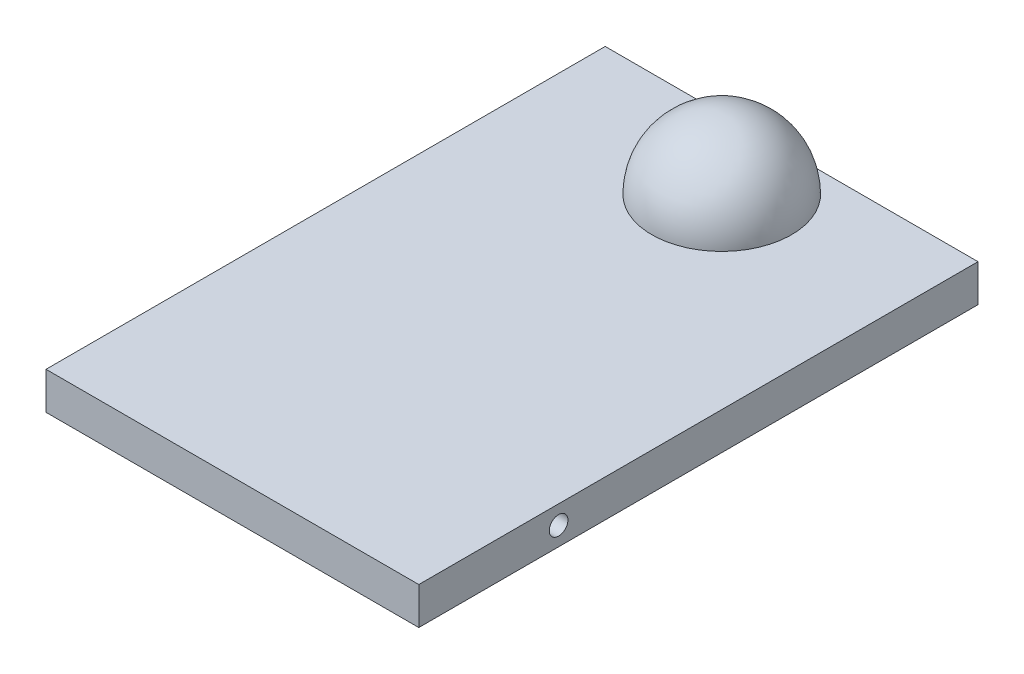
ISO-10303-21;
HEADER;
FILE_DESCRIPTION(('STEP AP214'),'2;1');
FILE_NAME('part.step','',(''),(''),'','','');
FILE_SCHEMA(('AUTOMOTIVE_DESIGN { 1 0 10303 214 1 1 1 1 }'));
ENDSEC;
DATA;
#1=APPLICATION_CONTEXT('core data for automotive mechanical design processes');
#2=APPLICATION_PROTOCOL_DEFINITION('international standard','automotive_design',2000,#1);
#3=PRODUCT_CONTEXT('',#1,'mechanical');
#4=PRODUCT('Part','Part','',(#3));
#5=PRODUCT_RELATED_PRODUCT_CATEGORY('part','',(#4));
#6=PRODUCT_DEFINITION_FORMATION('','',#4);
#7=PRODUCT_DEFINITION_CONTEXT('part definition',#1,'design');
#8=PRODUCT_DEFINITION('design','',#6,#7);
#9=PRODUCT_DEFINITION_SHAPE('','',#8);
#10=(LENGTH_UNIT() NAMED_UNIT(*) SI_UNIT(.MILLI.,.METRE.));
#11=(NAMED_UNIT(*) PLANE_ANGLE_UNIT() SI_UNIT($,.RADIAN.));
#12=(NAMED_UNIT(*) SI_UNIT($,.STERADIAN.) SOLID_ANGLE_UNIT());
#13=UNCERTAINTY_MEASURE_WITH_UNIT(LENGTH_MEASURE(1.E-05),#10,'distance_accuracy_value','');
#14=(GEOMETRIC_REPRESENTATION_CONTEXT(3) GLOBAL_UNCERTAINTY_ASSIGNED_CONTEXT((#13)) GLOBAL_UNIT_ASSIGNED_CONTEXT((#10,
#11,#12)) REPRESENTATION_CONTEXT('',''));
#15=CARTESIAN_POINT('',(0.,0.,0.));
#16=DIRECTION('',(0.,0.,1.));
#17=DIRECTION('',(1.,0.,0.));
#18=AXIS2_PLACEMENT_3D('',#15,#16,#17);
#19=CARTESIAN_POINT('',(50.,10.,-75.));
#20=DIRECTION('',(-1.,0.,0.));
#21=DIRECTION('',(0.,0.,1.));
#22=AXIS2_PLACEMENT_3D('',#19,#20,#21);
#23=PLANE('',#22);
#24=CARTESIAN_POINT('',(50.,5.,37.5));
#25=DIRECTION('',(-1.,0.,0.));
#26=DIRECTION('',(0.,0.,1.));
#27=AXIS2_PLACEMENT_3D('',#24,#25,#26);
#28=CIRCLE('',#27,2.5);
#29=CARTESIAN_POINT('',(50.,5.,40.));
#30=VERTEX_POINT('',#29);
#31=EDGE_CURVE('E119',#30,#30,#28,.T.);
#32=ORIENTED_EDGE('',*,*,#31,.T.);
#33=EDGE_LOOP('',(#32));
#34=FACE_BOUND('',#33,.T.);
#35=DIRECTION('',(0.,0.,-1.));
#36=VECTOR('',#35,1.);
#37=CARTESIAN_POINT('',(50.,0.,-75.));
#38=LINE('',#37,#36);
#39=CARTESIAN_POINT('',(50.,0.,75.));
#40=VERTEX_POINT('',#39);
#41=CARTESIAN_POINT('',(50.,0.,-75.));
#42=VERTEX_POINT('',#41);
#43=EDGE_CURVE('E102',#40,#42,#38,.T.);
#44=ORIENTED_EDGE('',*,*,#43,.T.);
#45=DIRECTION('',(0.,-1.,0.));
#46=VECTOR('',#45,1.);
#47=CARTESIAN_POINT('',(50.,10.,-75.));
#48=LINE('',#47,#46);
#49=CARTESIAN_POINT('',(50.,10.,-75.));
#50=VERTEX_POINT('',#49);
#51=EDGE_CURVE('E11',#50,#42,#48,.T.);
#52=ORIENTED_EDGE('',*,*,#51,.F.);
#53=DIRECTION('',(0.,0.,-1.));
#54=VECTOR('',#53,1.);
#55=CARTESIAN_POINT('',(50.,10.,-75.));
#56=LINE('',#55,#54);
#57=CARTESIAN_POINT('',(50.,10.,75.));
#58=VERTEX_POINT('',#57);
#59=EDGE_CURVE('E88',#58,#50,#56,.T.);
#60=ORIENTED_EDGE('',*,*,#59,.F.);
#61=DIRECTION('',(0.,-1.,0.));
#62=VECTOR('',#61,1.);
#63=CARTESIAN_POINT('',(50.,10.,75.));
#64=LINE('',#63,#62);
#65=EDGE_CURVE('E98',#58,#40,#64,.T.);
#66=ORIENTED_EDGE('',*,*,#65,.T.);
#67=EDGE_LOOP('',(#44,#52,#60,#66));
#68=FACE_BOUND('',#67,.T.);
#69=ADVANCED_FACE('F33',(#34,#68),#23,.F.);
#70=CARTESIAN_POINT('',(-50.,10.,-75.));
#71=DIRECTION('',(0.,0.,1.));
#72=DIRECTION('',(1.,0.,0.));
#73=AXIS2_PLACEMENT_3D('',#70,#71,#72);
#74=PLANE('',#73);
#75=DIRECTION('',(-1.,0.,0.));
#76=VECTOR('',#75,1.);
#77=CARTESIAN_POINT('',(-50.,0.,-75.));
#78=LINE('',#77,#76);
#79=CARTESIAN_POINT('',(-50.,0.,-75.));
#80=VERTEX_POINT('',#79);
#81=EDGE_CURVE('E92',#42,#80,#78,.T.);
#82=ORIENTED_EDGE('',*,*,#81,.T.);
#83=DIRECTION('',(0.,-1.,0.));
#84=VECTOR('',#83,1.);
#85=CARTESIAN_POINT('',(-50.,10.,-75.));
#86=LINE('',#85,#84);
#87=CARTESIAN_POINT('',(-50.,10.,-75.));
#88=VERTEX_POINT('',#87);
#89=EDGE_CURVE('E40',#88,#80,#86,.T.);
#90=ORIENTED_EDGE('',*,*,#89,.F.);
#91=DIRECTION('',(-1.,0.,0.));
#92=VECTOR('',#91,1.);
#93=CARTESIAN_POINT('',(-50.,10.,-75.));
#94=LINE('',#93,#92);
#95=CARTESIAN_POINT('',(0.,10.,-75.));
#96=VERTEX_POINT('',#95);
#97=EDGE_CURVE('E82',#96,#88,#94,.T.);
#98=ORIENTED_EDGE('',*,*,#97,.F.);
#99=EDGE_CURVE('E80',#50,#96,#94,.T.);
#100=ORIENTED_EDGE('',*,*,#99,.F.);
#101=ORIENTED_EDGE('',*,*,#51,.T.);
#102=EDGE_LOOP('',(#82,#90,#98,#100,#101));
#103=FACE_BOUND('',#102,.T.);
#104=ADVANCED_FACE('F91',(#103),#74,.F.);
#105=CARTESIAN_POINT('',(-50.,10.,-75.));
#106=DIRECTION('',(1.,0.,0.));
#107=DIRECTION('',(0.,0.,-1.));
#108=AXIS2_PLACEMENT_3D('',#105,#106,#107);
#109=PLANE('',#108);
#110=CARTESIAN_POINT('',(-50.,5.,37.5));
#111=DIRECTION('',(-1.,0.,0.));
#112=DIRECTION('',(0.,0.,1.));
#113=AXIS2_PLACEMENT_3D('',#110,#111,#112);
#114=CIRCLE('',#113,2.5);
#115=CARTESIAN_POINT('',(-50.,5.,40.));
#116=VERTEX_POINT('',#115);
#117=EDGE_CURVE('E120',#116,#116,#114,.T.);
#118=ORIENTED_EDGE('',*,*,#117,.F.);
#119=EDGE_LOOP('',(#118));
#120=FACE_BOUND('',#119,.T.);
#121=DIRECTION('',(0.,0.,1.));
#122=VECTOR('',#121,1.);
#123=CARTESIAN_POINT('',(-50.,0.,-75.));
#124=LINE('',#123,#122);
#125=CARTESIAN_POINT('',(-50.,0.,75.));
#126=VERTEX_POINT('',#125);
#127=EDGE_CURVE('E106',#80,#126,#124,.T.);
#128=ORIENTED_EDGE('',*,*,#127,.T.);
#129=DIRECTION('',(0.,-1.,0.));
#130=VECTOR('',#129,1.);
#131=CARTESIAN_POINT('',(-50.,10.,75.));
#132=LINE('',#131,#130);
#133=CARTESIAN_POINT('',(-50.,10.,75.));
#134=VERTEX_POINT('',#133);
#135=EDGE_CURVE('E95',#134,#126,#132,.T.);
#136=ORIENTED_EDGE('',*,*,#135,.F.);
#137=DIRECTION('',(0.,0.,1.));
#138=VECTOR('',#137,1.);
#139=CARTESIAN_POINT('',(-50.,10.,-75.));
#140=LINE('',#139,#138);
#141=EDGE_CURVE('E86',#88,#134,#140,.T.);
#142=ORIENTED_EDGE('',*,*,#141,.F.);
#143=ORIENTED_EDGE('',*,*,#89,.T.);
#144=EDGE_LOOP('',(#128,#136,#142,#143));
#145=FACE_BOUND('',#144,.T.);
#146=ADVANCED_FACE('F96',(#120,#145),#109,.F.);
#147=CARTESIAN_POINT('',(-50.,10.,75.));
#148=DIRECTION('',(0.,0.,-1.));
#149=DIRECTION('',(-1.,0.,0.));
#150=AXIS2_PLACEMENT_3D('',#147,#148,#149);
#151=PLANE('',#150);
#152=DIRECTION('',(1.,0.,0.));
#153=VECTOR('',#152,1.);
#154=CARTESIAN_POINT('',(-50.,0.,75.));
#155=LINE('',#154,#153);
#156=EDGE_CURVE('E73',#126,#40,#155,.T.);
#157=ORIENTED_EDGE('',*,*,#156,.T.);
#158=ORIENTED_EDGE('',*,*,#65,.F.);
#159=DIRECTION('',(1.,0.,0.));
#160=VECTOR('',#159,1.);
#161=CARTESIAN_POINT('',(-50.,10.,75.));
#162=LINE('',#161,#160);
#163=EDGE_CURVE('E53',#134,#58,#162,.T.);
#164=ORIENTED_EDGE('',*,*,#163,.F.);
#165=ORIENTED_EDGE('',*,*,#135,.T.);
#166=EDGE_LOOP('',(#157,#158,#164,#165));
#167=FACE_BOUND('',#166,.T.);
#168=ADVANCED_FACE('F110',(#167),#151,.F.);
#169=CARTESIAN_POINT('',(0.,10.,0.));
#170=DIRECTION('',(0.,1.,0.));
#171=DIRECTION('',(0.,0.,1.));
#172=AXIS2_PLACEMENT_3D('',#169,#170,#171);
#173=PLANE('',#172);
#174=ORIENTED_EDGE('',*,*,#99,.T.);
#175=CARTESIAN_POINT('',(0.,10.,-56.25));
#176=DIRECTION('',(0.,-1.,0.));
#177=DIRECTION('',(0.,0.,-1.));
#178=AXIS2_PLACEMENT_3D('',#175,#176,#177);
#179=CIRCLE('',#178,18.75);
#180=EDGE_CURVE('E45',#96,#96,#179,.T.);
#181=ORIENTED_EDGE('',*,*,#180,.T.);
#182=ORIENTED_EDGE('',*,*,#97,.T.);
#183=ORIENTED_EDGE('',*,*,#141,.T.);
#184=ORIENTED_EDGE('',*,*,#163,.T.);
#185=ORIENTED_EDGE('',*,*,#59,.T.);
#186=EDGE_LOOP('',(#174,#181,#182,#183,#184,#185));
#187=FACE_BOUND('',#186,.T.);
#188=ADVANCED_FACE('F84',(#187),#173,.T.);
#189=CARTESIAN_POINT('',(0.,0.,0.));
#190=DIRECTION('',(0.,1.,0.));
#191=DIRECTION('',(0.,0.,1.));
#192=AXIS2_PLACEMENT_3D('',#189,#190,#191);
#193=PLANE('',#192);
#194=ORIENTED_EDGE('',*,*,#43,.F.);
#195=ORIENTED_EDGE('',*,*,#156,.F.);
#196=ORIENTED_EDGE('',*,*,#127,.F.);
#197=ORIENTED_EDGE('',*,*,#81,.F.);
#198=EDGE_LOOP('',(#194,#195,#196,#197));
#199=FACE_BOUND('',#198,.T.);
#200=ADVANCED_FACE('F113',(#199),#193,.F.);
#201=CARTESIAN_POINT('',(0.,10.,-56.25));
#202=DIRECTION('',(0.,0.,-1.));
#203=DIRECTION('',(1.,0.,0.));
#204=AXIS2_PLACEMENT_3D('',#201,#202,#203);
#205=SPHERICAL_SURFACE('',#204,18.75);
#206=CARTESIAN_POINT('',(0.,10.,-56.25));
#207=DIRECTION('',(0.,-1.,0.));
#208=DIRECTION('',(0.,0.,-1.));
#209=AXIS2_PLACEMENT_3D('',#206,#207,#208);
#210=SPHERICAL_SURFACE('',#209,18.75);
#211=ORIENTED_EDGE('',*,*,#180,.F.);
#212=EDGE_LOOP('',(#211));
#213=FACE_BOUND('',#212,.T.);
#214=ADVANCED_FACE('F130',(#213),#210,.T.);
#215=CARTESIAN_POINT('',(50.,5.,37.5));
#216=DIRECTION('',(-1.,0.,0.));
#217=DIRECTION('',(0.,0.,1.));
#218=AXIS2_PLACEMENT_3D('',#215,#216,#217);
#219=CYLINDRICAL_SURFACE('',#218,2.5);
#220=ORIENTED_EDGE('',*,*,#31,.F.);
#221=EDGE_LOOP('',(#220));
#222=FACE_BOUND('',#221,.T.);
#223=ORIENTED_EDGE('',*,*,#117,.T.);
#224=EDGE_LOOP('',(#223));
#225=FACE_BOUND('',#224,.T.);
#226=ADVANCED_FACE('F127',(#222,#225),#219,.F.);
#227=CLOSED_SHELL('',(#69,#104,#146,#168,#188,#200,#214,#226));
#228=MANIFOLD_SOLID_BREP('B2',#227);
#229=ADVANCED_BREP_SHAPE_REPRESENTATION('',(#18,#228),#14);
#230=SHAPE_DEFINITION_REPRESENTATION(#9,#229);
ENDSEC;
END-ISO-10303-21;
